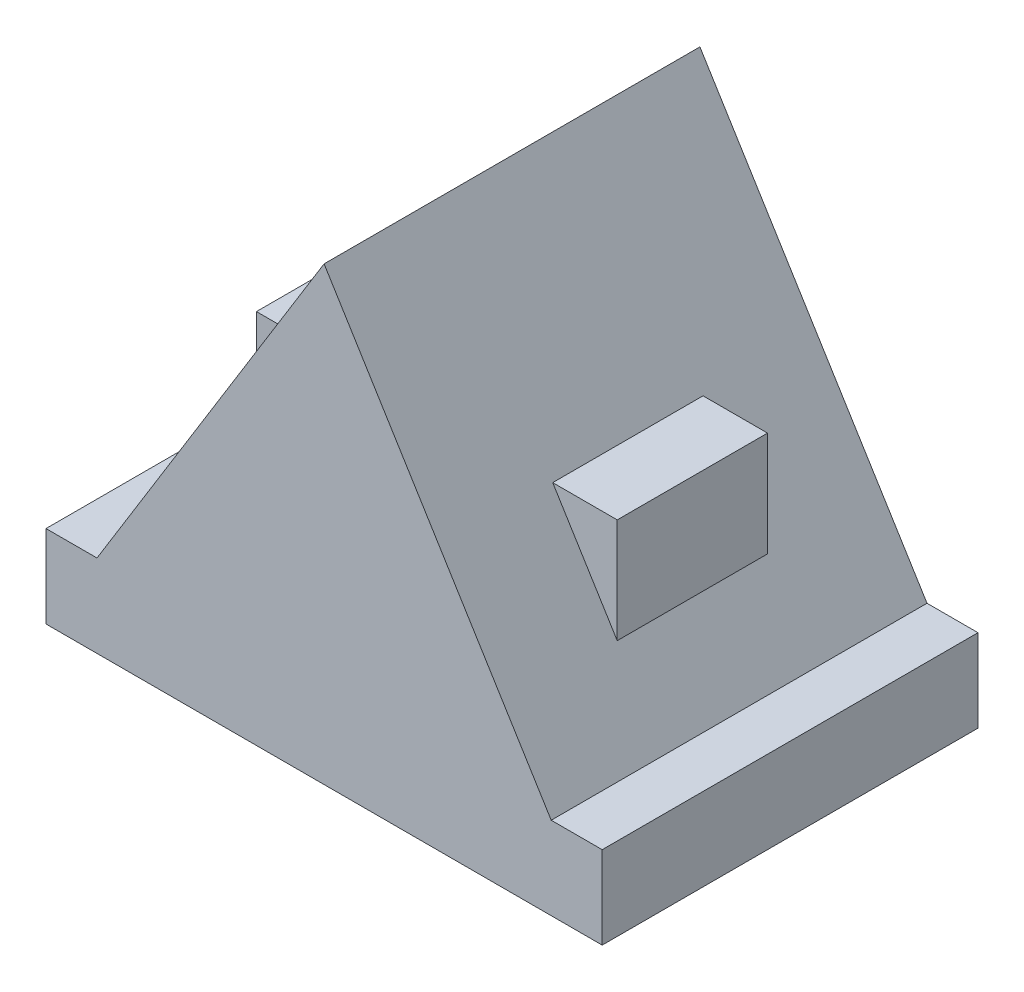
ISO-10303-21;
HEADER;
FILE_DESCRIPTION(('STEP AP214'),'2;1');
FILE_NAME('part.step','',(''),(''),'','','');
FILE_SCHEMA(('AUTOMOTIVE_DESIGN { 1 0 10303 214 1 1 1 1 }'));
ENDSEC;
DATA;
#1=APPLICATION_CONTEXT('core data for automotive mechanical design processes');
#2=APPLICATION_PROTOCOL_DEFINITION('international standard','automotive_design',2000,#1);
#3=PRODUCT_CONTEXT('',#1,'mechanical');
#4=PRODUCT('Part','Part','',(#3));
#5=PRODUCT_RELATED_PRODUCT_CATEGORY('part','',(#4));
#6=PRODUCT_DEFINITION_FORMATION('','',#4);
#7=PRODUCT_DEFINITION_CONTEXT('part definition',#1,'design');
#8=PRODUCT_DEFINITION('design','',#6,#7);
#9=PRODUCT_DEFINITION_SHAPE('','',#8);
#10=(LENGTH_UNIT() NAMED_UNIT(*) SI_UNIT(.MILLI.,.METRE.));
#11=(NAMED_UNIT(*) PLANE_ANGLE_UNIT() SI_UNIT($,.RADIAN.));
#12=(NAMED_UNIT(*) SI_UNIT($,.STERADIAN.) SOLID_ANGLE_UNIT());
#13=UNCERTAINTY_MEASURE_WITH_UNIT(LENGTH_MEASURE(1.E-05),#10,'distance_accuracy_value','');
#14=(GEOMETRIC_REPRESENTATION_CONTEXT(3) GLOBAL_UNCERTAINTY_ASSIGNED_CONTEXT((#13)) GLOBAL_UNIT_ASSIGNED_CONTEXT((#10,
#11,#12)) REPRESENTATION_CONTEXT('',''));
#15=CARTESIAN_POINT('',(0.,0.,0.));
#16=DIRECTION('',(0.,0.,1.));
#17=DIRECTION('',(1.,0.,0.));
#18=AXIS2_PLACEMENT_3D('',#15,#16,#17);
#19=CARTESIAN_POINT('',(37.,0.,-25.));
#20=DIRECTION('',(0.85117086972399,0.524888702996461,0.));
#21=DIRECTION('',(-0.524888702996461,0.85117086972399,0.));
#22=AXIS2_PLACEMENT_3D('',#19,#20,#21);
#23=PLANE('',#22);
#24=DIRECTION('',(0.,0.,1.));
#25=VECTOR('',#24,1.);
#26=CARTESIAN_POINT('',(18.5,30.,-25.));
#27=LINE('',#26,#25);
#28=CARTESIAN_POINT('',(18.5,30.,-25.));
#29=VERTEX_POINT('',#28);
#30=CARTESIAN_POINT('',(18.5,30.,25.));
#31=VERTEX_POINT('',#30);
#32=EDGE_CURVE('E11',#29,#31,#27,.T.);
#33=ORIENTED_EDGE('',*,*,#32,.T.);
#34=DIRECTION('',(-0.524888702996461,0.85117086972399,0.));
#35=VECTOR('',#34,1.);
#36=CARTESIAN_POINT('',(37.,0.,25.));
#37=LINE('',#36,#35);
#38=CARTESIAN_POINT('',(48.7166666666667,-19.,25.));
#39=VERTEX_POINT('',#38);
#40=EDGE_CURVE('E156',#39,#31,#37,.T.);
#41=ORIENTED_EDGE('',*,*,#40,.F.);
#42=DIRECTION('',(0.,0.,1.));
#43=VECTOR('',#42,1.);
#44=CARTESIAN_POINT('',(48.7166666666667,-19.,-25.));
#45=LINE('',#44,#43);
#46=CARTESIAN_POINT('',(48.7166666666667,-19.,-25.));
#47=VERTEX_POINT('',#46);
#48=EDGE_CURVE('E177',#47,#39,#45,.T.);
#49=ORIENTED_EDGE('',*,*,#48,.F.);
#50=DIRECTION('',(-0.524888702996461,0.85117086972399,0.));
#51=VECTOR('',#50,1.);
#52=CARTESIAN_POINT('',(37.,0.,-25.));
#53=LINE('',#52,#51);
#54=EDGE_CURVE('E167',#47,#29,#53,.T.);
#55=ORIENTED_EDGE('',*,*,#54,.T.);
#56=EDGE_LOOP('',(#33,#41,#49,#55));
#57=FACE_BOUND('',#56,.T.);
#58=DIRECTION('',(0.,0.,1.));
#59=VECTOR('',#58,1.);
#60=CARTESIAN_POINT('',(33.9166666666667,5.,-10.));
#61=LINE('',#60,#59);
#62=CARTESIAN_POINT('',(33.9166666666667,5.,-10.));
#63=VERTEX_POINT('',#62);
#64=CARTESIAN_POINT('',(33.9166666666667,5.,10.));
#65=VERTEX_POINT('',#64);
#66=EDGE_CURVE('E54',#63,#65,#61,.T.);
#67=ORIENTED_EDGE('',*,*,#66,.F.);
#68=DIRECTION('',(-0.524888702996461,0.85117086972399,0.));
#69=VECTOR('',#68,1.);
#70=CARTESIAN_POINT('',(37.,0.,-10.));
#71=LINE('',#70,#69);
#72=CARTESIAN_POINT('',(42.5,-8.91891891891892,-10.));
#73=VERTEX_POINT('',#72);
#74=EDGE_CURVE('E58',#73,#63,#71,.T.);
#75=ORIENTED_EDGE('',*,*,#74,.F.);
#76=DIRECTION('',(0.,0.,1.));
#77=VECTOR('',#76,1.);
#78=CARTESIAN_POINT('',(42.5,-8.91891891891892,-10.));
#79=LINE('',#78,#77);
#80=CARTESIAN_POINT('',(42.5,-8.91891891891892,10.));
#81=VERTEX_POINT('',#80);
#82=EDGE_CURVE('E129',#73,#81,#79,.T.);
#83=ORIENTED_EDGE('',*,*,#82,.T.);
#84=DIRECTION('',(-0.524888702996461,0.85117086972399,0.));
#85=VECTOR('',#84,1.);
#86=CARTESIAN_POINT('',(37.,0.,10.));
#87=LINE('',#86,#85);
#88=EDGE_CURVE('E132',#81,#65,#87,.T.);
#89=ORIENTED_EDGE('',*,*,#88,.T.);
#90=EDGE_LOOP('',(#67,#75,#83,#89));
#91=FACE_BOUND('',#90,.T.);
#92=ADVANCED_FACE('F37',(#57,#91),#23,.T.);
#93=CARTESIAN_POINT('',(0.,0.,-25.));
#94=DIRECTION('',(0.85117086972399,-0.524888702996461,0.));
#95=DIRECTION('',(0.524888702996461,0.85117086972399,0.));
#96=AXIS2_PLACEMENT_3D('',#93,#94,#95);
#97=PLANE('',#96);
#98=DIRECTION('',(0.,0.,1.));
#99=VECTOR('',#98,1.);
#100=CARTESIAN_POINT('',(-11.7166666666667,-19.,-25.));
#101=LINE('',#100,#99);
#102=CARTESIAN_POINT('',(-11.7166666666667,-19.,-25.));
#103=VERTEX_POINT('',#102);
#104=CARTESIAN_POINT('',(-11.7166666666667,-19.,25.));
#105=VERTEX_POINT('',#104);
#106=EDGE_CURVE('E41',#103,#105,#101,.T.);
#107=ORIENTED_EDGE('',*,*,#106,.T.);
#108=DIRECTION('',(0.524888702996461,0.85117086972399,0.));
#109=VECTOR('',#108,1.);
#110=CARTESIAN_POINT('',(0.,0.,25.));
#111=LINE('',#110,#109);
#112=EDGE_CURVE('E202',#105,#31,#111,.T.);
#113=ORIENTED_EDGE('',*,*,#112,.T.);
#114=ORIENTED_EDGE('',*,*,#32,.F.);
#115=DIRECTION('',(0.524888702996461,0.85117086972399,0.));
#116=VECTOR('',#115,1.);
#117=CARTESIAN_POINT('',(0.,0.,-25.));
#118=LINE('',#117,#116);
#119=EDGE_CURVE('E216',#103,#29,#118,.T.);
#120=ORIENTED_EDGE('',*,*,#119,.F.);
#121=EDGE_LOOP('',(#107,#113,#114,#120));
#122=FACE_BOUND('',#121,.T.);
#123=DIRECTION('',(0.524888702996461,0.85117086972399,0.));
#124=VECTOR('',#123,1.);
#125=CARTESIAN_POINT('',(0.,0.,-10.));
#126=LINE('',#125,#124);
#127=CARTESIAN_POINT('',(-5.5,-8.91891891891892,-10.));
#128=VERTEX_POINT('',#127);
#129=CARTESIAN_POINT('',(3.08333333333334,5.,-10.));
#130=VERTEX_POINT('',#129);
#131=EDGE_CURVE('E195',#128,#130,#126,.T.);
#132=ORIENTED_EDGE('',*,*,#131,.T.);
#133=DIRECTION('',(0.,0.,1.));
#134=VECTOR('',#133,1.);
#135=CARTESIAN_POINT('',(3.08333333333334,5.,-10.));
#136=LINE('',#135,#134);
#137=CARTESIAN_POINT('',(3.08333333333334,5.,10.));
#138=VERTEX_POINT('',#137);
#139=EDGE_CURVE('E199',#130,#138,#136,.T.);
#140=ORIENTED_EDGE('',*,*,#139,.T.);
#141=DIRECTION('',(0.524888702996461,0.85117086972399,0.));
#142=VECTOR('',#141,1.);
#143=CARTESIAN_POINT('',(0.,0.,10.));
#144=LINE('',#143,#142);
#145=CARTESIAN_POINT('',(-5.5,-8.91891891891892,10.));
#146=VERTEX_POINT('',#145);
#147=EDGE_CURVE('E189',#146,#138,#144,.T.);
#148=ORIENTED_EDGE('',*,*,#147,.F.);
#149=DIRECTION('',(0.,0.,1.));
#150=VECTOR('',#149,1.);
#151=CARTESIAN_POINT('',(-5.5,-8.91891891891892,-10.));
#152=LINE('',#151,#150);
#153=EDGE_CURVE('E203',#128,#146,#152,.T.);
#154=ORIENTED_EDGE('',*,*,#153,.F.);
#155=EDGE_LOOP('',(#132,#140,#148,#154));
#156=FACE_BOUND('',#155,.T.);
#157=ADVANCED_FACE('F39',(#122,#156),#97,.F.);
#158=CARTESIAN_POINT('',(0.,-30.,-25.));
#159=DIRECTION('',(0.,-1.,0.));
#160=DIRECTION('',(0.,0.,-1.));
#161=AXIS2_PLACEMENT_3D('',#158,#159,#160);
#162=PLANE('',#161);
#163=DIRECTION('',(1.,0.,0.));
#164=VECTOR('',#163,1.);
#165=CARTESIAN_POINT('',(0.,-30.,-25.));
#166=LINE('',#165,#164);
#167=CARTESIAN_POINT('',(-18.5,-30.,-25.));
#168=VERTEX_POINT('',#167);
#169=CARTESIAN_POINT('',(55.5,-30.,-25.));
#170=VERTEX_POINT('',#169);
#171=EDGE_CURVE('E223',#168,#170,#166,.T.);
#172=ORIENTED_EDGE('',*,*,#171,.T.);
#173=DIRECTION('',(0.,0.,1.));
#174=VECTOR('',#173,1.);
#175=CARTESIAN_POINT('',(55.5,-30.,-25.));
#176=LINE('',#175,#174);
#177=CARTESIAN_POINT('',(55.5,-30.,25.));
#178=VERTEX_POINT('',#177);
#179=EDGE_CURVE('E176',#170,#178,#176,.T.);
#180=ORIENTED_EDGE('',*,*,#179,.T.);
#181=DIRECTION('',(1.,0.,0.));
#182=VECTOR('',#181,1.);
#183=CARTESIAN_POINT('',(0.,-30.,25.));
#184=LINE('',#183,#182);
#185=CARTESIAN_POINT('',(-18.5,-30.,25.));
#186=VERTEX_POINT('',#185);
#187=EDGE_CURVE('E214',#186,#178,#184,.T.);
#188=ORIENTED_EDGE('',*,*,#187,.F.);
#189=DIRECTION('',(0.,0.,1.));
#190=VECTOR('',#189,1.);
#191=CARTESIAN_POINT('',(-18.5,-30.,-25.));
#192=LINE('',#191,#190);
#193=EDGE_CURVE('E46',#168,#186,#192,.T.);
#194=ORIENTED_EDGE('',*,*,#193,.F.);
#195=EDGE_LOOP('',(#172,#180,#188,#194));
#196=FACE_BOUND('',#195,.T.);
#197=ADVANCED_FACE('F249',(#196),#162,.T.);
#198=CARTESIAN_POINT('',(-18.5,0.,-25.));
#199=DIRECTION('',(1.,0.,0.));
#200=DIRECTION('',(0.,0.,-1.));
#201=AXIS2_PLACEMENT_3D('',#198,#199,#200);
#202=PLANE('',#201);
#203=ORIENTED_EDGE('',*,*,#193,.T.);
#204=DIRECTION('',(0.,1.,0.));
#205=VECTOR('',#204,1.);
#206=CARTESIAN_POINT('',(-18.5,0.,25.));
#207=LINE('',#206,#205);
#208=CARTESIAN_POINT('',(-18.5,-19.,25.));
#209=VERTEX_POINT('',#208);
#210=EDGE_CURVE('E211',#186,#209,#207,.T.);
#211=ORIENTED_EDGE('',*,*,#210,.T.);
#212=DIRECTION('',(0.,0.,1.));
#213=VECTOR('',#212,1.);
#214=CARTESIAN_POINT('',(-18.5,-19.,-25.));
#215=LINE('',#214,#213);
#216=CARTESIAN_POINT('',(-18.5,-19.,-25.));
#217=VERTEX_POINT('',#216);
#218=EDGE_CURVE('E225',#217,#209,#215,.T.);
#219=ORIENTED_EDGE('',*,*,#218,.F.);
#220=DIRECTION('',(0.,1.,0.));
#221=VECTOR('',#220,1.);
#222=CARTESIAN_POINT('',(-18.5,0.,-25.));
#223=LINE('',#222,#221);
#224=EDGE_CURVE('E221',#168,#217,#223,.T.);
#225=ORIENTED_EDGE('',*,*,#224,.F.);
#226=EDGE_LOOP('',(#203,#211,#219,#225));
#227=FACE_BOUND('',#226,.T.);
#228=ADVANCED_FACE('F242',(#227),#202,.F.);
#229=CARTESIAN_POINT('',(0.,-19.,-25.));
#230=DIRECTION('',(0.,-1.,0.));
#231=DIRECTION('',(0.,0.,-1.));
#232=AXIS2_PLACEMENT_3D('',#229,#230,#231);
#233=PLANE('',#232);
#234=ORIENTED_EDGE('',*,*,#218,.T.);
#235=DIRECTION('',(1.,0.,0.));
#236=VECTOR('',#235,1.);
#237=CARTESIAN_POINT('',(0.,-19.,25.));
#238=LINE('',#237,#236);
#239=EDGE_CURVE('E208',#209,#105,#238,.T.);
#240=ORIENTED_EDGE('',*,*,#239,.T.);
#241=ORIENTED_EDGE('',*,*,#106,.F.);
#242=DIRECTION('',(1.,0.,0.));
#243=VECTOR('',#242,1.);
#244=CARTESIAN_POINT('',(0.,-19.,-25.));
#245=LINE('',#244,#243);
#246=EDGE_CURVE('E219',#217,#103,#245,.T.);
#247=ORIENTED_EDGE('',*,*,#246,.F.);
#248=EDGE_LOOP('',(#234,#240,#241,#247));
#249=FACE_BOUND('',#248,.T.);
#250=ADVANCED_FACE('F239',(#249),#233,.F.);
#251=CARTESIAN_POINT('',(0.,0.,-25.));
#252=DIRECTION('',(0.,0.,1.));
#253=DIRECTION('',(1.,0.,0.));
#254=AXIS2_PLACEMENT_3D('',#251,#252,#253);
#255=PLANE('',#254);
#256=ORIENTED_EDGE('',*,*,#119,.T.);
#257=ORIENTED_EDGE('',*,*,#54,.F.);
#258=DIRECTION('',(-1.,0.,0.));
#259=VECTOR('',#258,1.);
#260=CARTESIAN_POINT('',(37.,-19.,-25.));
#261=LINE('',#260,#259);
#262=CARTESIAN_POINT('',(55.5,-19.,-25.));
#263=VERTEX_POINT('',#262);
#264=EDGE_CURVE('E173',#263,#47,#261,.T.);
#265=ORIENTED_EDGE('',*,*,#264,.F.);
#266=DIRECTION('',(0.,1.,0.));
#267=VECTOR('',#266,1.);
#268=CARTESIAN_POINT('',(55.5,0.,-25.));
#269=LINE('',#268,#267);
#270=EDGE_CURVE('E170',#170,#263,#269,.T.);
#271=ORIENTED_EDGE('',*,*,#270,.F.);
#272=ORIENTED_EDGE('',*,*,#171,.F.);
#273=ORIENTED_EDGE('',*,*,#224,.T.);
#274=ORIENTED_EDGE('',*,*,#246,.T.);
#275=EDGE_LOOP('',(#256,#257,#265,#271,#272,#273,#274));
#276=FACE_BOUND('',#275,.T.);
#277=ADVANCED_FACE('F241',(#276),#255,.F.);
#278=CARTESIAN_POINT('',(0.,0.,25.));
#279=DIRECTION('',(0.,0.,1.));
#280=DIRECTION('',(1.,0.,0.));
#281=AXIS2_PLACEMENT_3D('',#278,#279,#280);
#282=PLANE('',#281);
#283=ORIENTED_EDGE('',*,*,#112,.F.);
#284=ORIENTED_EDGE('',*,*,#239,.F.);
#285=ORIENTED_EDGE('',*,*,#210,.F.);
#286=ORIENTED_EDGE('',*,*,#187,.T.);
#287=DIRECTION('',(0.,1.,0.));
#288=VECTOR('',#287,1.);
#289=CARTESIAN_POINT('',(55.5,0.,25.));
#290=LINE('',#289,#288);
#291=CARTESIAN_POINT('',(55.5,-19.,25.));
#292=VERTEX_POINT('',#291);
#293=EDGE_CURVE('E161',#178,#292,#290,.T.);
#294=ORIENTED_EDGE('',*,*,#293,.T.);
#295=DIRECTION('',(-1.,0.,0.));
#296=VECTOR('',#295,1.);
#297=CARTESIAN_POINT('',(37.,-19.,25.));
#298=LINE('',#297,#296);
#299=EDGE_CURVE('E164',#292,#39,#298,.T.);
#300=ORIENTED_EDGE('',*,*,#299,.T.);
#301=ORIENTED_EDGE('',*,*,#40,.T.);
#302=EDGE_LOOP('',(#283,#284,#285,#286,#294,#300,#301));
#303=FACE_BOUND('',#302,.T.);
#304=ADVANCED_FACE('F236',(#303),#282,.T.);
#305=CARTESIAN_POINT('',(0.,5.,-10.));
#306=DIRECTION('',(0.,-1.,0.));
#307=DIRECTION('',(0.,0.,-1.));
#308=AXIS2_PLACEMENT_3D('',#305,#306,#307);
#309=PLANE('',#308);
#310=DIRECTION('',(0.,0.,1.));
#311=VECTOR('',#310,1.);
#312=CARTESIAN_POINT('',(-5.5,5.,-10.));
#313=LINE('',#312,#311);
#314=CARTESIAN_POINT('',(-5.5,5.,-10.));
#315=VERTEX_POINT('',#314);
#316=CARTESIAN_POINT('',(-5.5,5.,10.));
#317=VERTEX_POINT('',#316);
#318=EDGE_CURVE('E198',#315,#317,#313,.T.);
#319=ORIENTED_EDGE('',*,*,#318,.T.);
#320=DIRECTION('',(1.,0.,0.));
#321=VECTOR('',#320,1.);
#322=CARTESIAN_POINT('',(0.,5.,10.));
#323=LINE('',#322,#321);
#324=EDGE_CURVE('E179',#317,#138,#323,.T.);
#325=ORIENTED_EDGE('',*,*,#324,.T.);
#326=ORIENTED_EDGE('',*,*,#139,.F.);
#327=DIRECTION('',(1.,0.,0.));
#328=VECTOR('',#327,1.);
#329=CARTESIAN_POINT('',(0.,5.,-10.));
#330=LINE('',#329,#328);
#331=EDGE_CURVE('E191',#315,#130,#330,.T.);
#332=ORIENTED_EDGE('',*,*,#331,.F.);
#333=EDGE_LOOP('',(#319,#325,#326,#332));
#334=FACE_BOUND('',#333,.T.);
#335=ADVANCED_FACE('F274',(#334),#309,.F.);
#336=CARTESIAN_POINT('',(-5.5,0.,-10.));
#337=DIRECTION('',(1.,0.,0.));
#338=DIRECTION('',(0.,0.,-1.));
#339=AXIS2_PLACEMENT_3D('',#336,#337,#338);
#340=PLANE('',#339);
#341=ORIENTED_EDGE('',*,*,#153,.T.);
#342=DIRECTION('',(0.,1.,0.));
#343=VECTOR('',#342,1.);
#344=CARTESIAN_POINT('',(-5.5,0.,10.));
#345=LINE('',#344,#343);
#346=EDGE_CURVE('E186',#146,#317,#345,.T.);
#347=ORIENTED_EDGE('',*,*,#346,.T.);
#348=ORIENTED_EDGE('',*,*,#318,.F.);
#349=DIRECTION('',(0.,1.,0.));
#350=VECTOR('',#349,1.);
#351=CARTESIAN_POINT('',(-5.5,0.,-10.));
#352=LINE('',#351,#350);
#353=EDGE_CURVE('E193',#128,#315,#352,.T.);
#354=ORIENTED_EDGE('',*,*,#353,.F.);
#355=EDGE_LOOP('',(#341,#347,#348,#354));
#356=FACE_BOUND('',#355,.T.);
#357=ADVANCED_FACE('F270',(#356),#340,.F.);
#358=CARTESIAN_POINT('',(0.,0.,-10.));
#359=DIRECTION('',(0.,0.,1.));
#360=DIRECTION('',(1.,0.,0.));
#361=AXIS2_PLACEMENT_3D('',#358,#359,#360);
#362=PLANE('',#361);
#363=ORIENTED_EDGE('',*,*,#331,.T.);
#364=ORIENTED_EDGE('',*,*,#131,.F.);
#365=ORIENTED_EDGE('',*,*,#353,.T.);
#366=EDGE_LOOP('',(#363,#364,#365));
#367=FACE_BOUND('',#366,.T.);
#368=ADVANCED_FACE('F266',(#367),#362,.F.);
#369=CARTESIAN_POINT('',(0.,0.,10.));
#370=DIRECTION('',(0.,0.,1.));
#371=DIRECTION('',(1.,0.,0.));
#372=AXIS2_PLACEMENT_3D('',#369,#370,#371);
#373=PLANE('',#372);
#374=ORIENTED_EDGE('',*,*,#324,.F.);
#375=ORIENTED_EDGE('',*,*,#346,.F.);
#376=ORIENTED_EDGE('',*,*,#147,.T.);
#377=EDGE_LOOP('',(#374,#375,#376));
#378=FACE_BOUND('',#377,.T.);
#379=ADVANCED_FACE('F262',(#378),#373,.T.);
#380=CARTESIAN_POINT('',(37.,-19.,-25.));
#381=DIRECTION('',(0.,1.,0.));
#382=DIRECTION('',(0.,0.,1.));
#383=AXIS2_PLACEMENT_3D('',#380,#381,#382);
#384=PLANE('',#383);
#385=ORIENTED_EDGE('',*,*,#48,.T.);
#386=ORIENTED_EDGE('',*,*,#299,.F.);
#387=DIRECTION('',(0.,0.,1.));
#388=VECTOR('',#387,1.);
#389=CARTESIAN_POINT('',(55.5,-19.,-25.));
#390=LINE('',#389,#388);
#391=EDGE_CURVE('E180',#263,#292,#390,.T.);
#392=ORIENTED_EDGE('',*,*,#391,.F.);
#393=ORIENTED_EDGE('',*,*,#264,.T.);
#394=EDGE_LOOP('',(#385,#386,#392,#393));
#395=FACE_BOUND('',#394,.T.);
#396=ADVANCED_FACE('F265',(#395),#384,.T.);
#397=CARTESIAN_POINT('',(55.5,0.,-25.));
#398=DIRECTION('',(1.,0.,0.));
#399=DIRECTION('',(0.,0.,-1.));
#400=AXIS2_PLACEMENT_3D('',#397,#398,#399);
#401=PLANE('',#400);
#402=ORIENTED_EDGE('',*,*,#391,.T.);
#403=ORIENTED_EDGE('',*,*,#293,.F.);
#404=ORIENTED_EDGE('',*,*,#179,.F.);
#405=ORIENTED_EDGE('',*,*,#270,.T.);
#406=EDGE_LOOP('',(#402,#403,#404,#405));
#407=FACE_BOUND('',#406,.T.);
#408=ADVANCED_FACE('F260',(#407),#401,.T.);
#409=CARTESIAN_POINT('',(37.,5.,-10.));
#410=DIRECTION('',(0.,1.,0.));
#411=DIRECTION('',(0.,0.,1.));
#412=AXIS2_PLACEMENT_3D('',#409,#410,#411);
#413=PLANE('',#412);
#414=ORIENTED_EDGE('',*,*,#66,.T.);
#415=DIRECTION('',(-1.,0.,0.));
#416=VECTOR('',#415,1.);
#417=CARTESIAN_POINT('',(37.,5.,10.));
#418=LINE('',#417,#416);
#419=CARTESIAN_POINT('',(42.5,5.,10.));
#420=VERTEX_POINT('',#419);
#421=EDGE_CURVE('E147',#420,#65,#418,.T.);
#422=ORIENTED_EDGE('',*,*,#421,.F.);
#423=DIRECTION('',(0.,0.,1.));
#424=VECTOR('',#423,1.);
#425=CARTESIAN_POINT('',(42.5,5.,-10.));
#426=LINE('',#425,#424);
#427=CARTESIAN_POINT('',(42.5,5.,-10.));
#428=VERTEX_POINT('',#427);
#429=EDGE_CURVE('E136',#428,#420,#426,.T.);
#430=ORIENTED_EDGE('',*,*,#429,.F.);
#431=DIRECTION('',(-1.,0.,0.));
#432=VECTOR('',#431,1.);
#433=CARTESIAN_POINT('',(37.,5.,-10.));
#434=LINE('',#433,#432);
#435=EDGE_CURVE('E144',#428,#63,#434,.T.);
#436=ORIENTED_EDGE('',*,*,#435,.T.);
#437=EDGE_LOOP('',(#414,#422,#430,#436));
#438=FACE_BOUND('',#437,.T.);
#439=ADVANCED_FACE('F300',(#438),#413,.T.);
#440=CARTESIAN_POINT('',(42.5,0.,-10.));
#441=DIRECTION('',(1.,0.,0.));
#442=DIRECTION('',(0.,0.,-1.));
#443=AXIS2_PLACEMENT_3D('',#440,#441,#442);
#444=PLANE('',#443);
#445=ORIENTED_EDGE('',*,*,#429,.T.);
#446=DIRECTION('',(0.,1.,0.));
#447=VECTOR('',#446,1.);
#448=CARTESIAN_POINT('',(42.5,0.,10.));
#449=LINE('',#448,#447);
#450=EDGE_CURVE('E139',#81,#420,#449,.T.);
#451=ORIENTED_EDGE('',*,*,#450,.F.);
#452=ORIENTED_EDGE('',*,*,#82,.F.);
#453=DIRECTION('',(0.,1.,0.));
#454=VECTOR('',#453,1.);
#455=CARTESIAN_POINT('',(42.5,0.,-10.));
#456=LINE('',#455,#454);
#457=EDGE_CURVE('E154',#73,#428,#456,.T.);
#458=ORIENTED_EDGE('',*,*,#457,.T.);
#459=EDGE_LOOP('',(#445,#451,#452,#458));
#460=FACE_BOUND('',#459,.T.);
#461=ADVANCED_FACE('F140',(#460),#444,.T.);
#462=CARTESIAN_POINT('',(37.,0.,-10.));
#463=DIRECTION('',(0.,0.,1.));
#464=DIRECTION('',(-1.,0.,0.));
#465=AXIS2_PLACEMENT_3D('',#462,#463,#464);
#466=PLANE('',#465);
#467=ORIENTED_EDGE('',*,*,#435,.F.);
#468=ORIENTED_EDGE('',*,*,#457,.F.);
#469=ORIENTED_EDGE('',*,*,#74,.T.);
#470=EDGE_LOOP('',(#467,#468,#469));
#471=FACE_BOUND('',#470,.T.);
#472=ADVANCED_FACE('F307',(#471),#466,.F.);
#473=CARTESIAN_POINT('',(37.,0.,10.));
#474=DIRECTION('',(0.,0.,1.));
#475=DIRECTION('',(-1.,0.,0.));
#476=AXIS2_PLACEMENT_3D('',#473,#474,#475);
#477=PLANE('',#476);
#478=ORIENTED_EDGE('',*,*,#421,.T.);
#479=ORIENTED_EDGE('',*,*,#88,.F.);
#480=ORIENTED_EDGE('',*,*,#450,.T.);
#481=EDGE_LOOP('',(#478,#479,#480));
#482=FACE_BOUND('',#481,.T.);
#483=ADVANCED_FACE('F146',(#482),#477,.T.);
#484=CLOSED_SHELL('',(#92,#157,#197,#228,#250,#277,#304,#335,#357,#368,#379,#396,#408,#439,#461,
#472,#483));
#485=MANIFOLD_SOLID_BREP('B2',#484);
#486=ADVANCED_BREP_SHAPE_REPRESENTATION('',(#18,#485),#14);
#487=SHAPE_DEFINITION_REPRESENTATION(#9,#486);
ENDSEC;
END-ISO-10303-21;
